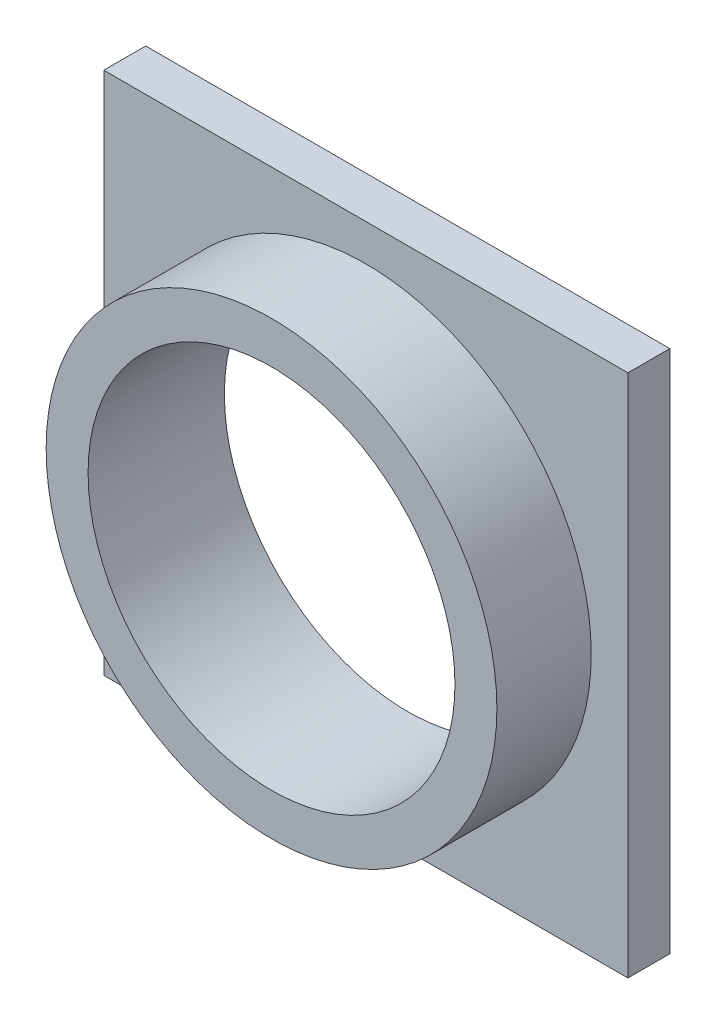
ISO-10303-21;
HEADER;
FILE_DESCRIPTION(('STEP AP214'),'2;1');
FILE_NAME('part.step','',(''),(''),'','','');
FILE_SCHEMA(('AUTOMOTIVE_DESIGN { 1 0 10303 214 1 1 1 1 }'));
ENDSEC;
DATA;
#1=APPLICATION_CONTEXT('core data for automotive mechanical design processes');
#2=APPLICATION_PROTOCOL_DEFINITION('international standard','automotive_design',2000,#1);
#3=PRODUCT_CONTEXT('',#1,'mechanical');
#4=PRODUCT('Part','Part','',(#3));
#5=PRODUCT_RELATED_PRODUCT_CATEGORY('part','',(#4));
#6=PRODUCT_DEFINITION_FORMATION('','',#4);
#7=PRODUCT_DEFINITION_CONTEXT('part definition',#1,'design');
#8=PRODUCT_DEFINITION('design','',#6,#7);
#9=PRODUCT_DEFINITION_SHAPE('','',#8);
#10=(LENGTH_UNIT() NAMED_UNIT(*) SI_UNIT(.MILLI.,.METRE.));
#11=(NAMED_UNIT(*) PLANE_ANGLE_UNIT() SI_UNIT($,.RADIAN.));
#12=(NAMED_UNIT(*) SI_UNIT($,.STERADIAN.) SOLID_ANGLE_UNIT());
#13=UNCERTAINTY_MEASURE_WITH_UNIT(LENGTH_MEASURE(1.E-05),#10,'distance_accuracy_value','');
#14=(GEOMETRIC_REPRESENTATION_CONTEXT(3) GLOBAL_UNCERTAINTY_ASSIGNED_CONTEXT((#13)) GLOBAL_UNIT_ASSIGNED_CONTEXT((#10,
#11,#12)) REPRESENTATION_CONTEXT('',''));
#15=CARTESIAN_POINT('',(0.,0.,0.));
#16=DIRECTION('',(0.,0.,1.));
#17=DIRECTION('',(1.,0.,0.));
#18=AXIS2_PLACEMENT_3D('',#15,#16,#17);
#19=CARTESIAN_POINT('',(-32.25,-32.79,68.5944084089785));
#20=DIRECTION('',(0.,0.,1.));
#21=DIRECTION('',(1.,0.,0.));
#22=AXIS2_PLACEMENT_3D('',#19,#20,#21);
#23=CYLINDRICAL_SURFACE('',#22,10.75);
#24=CARTESIAN_POINT('',(-32.25,-32.79,105.5));
#25=DIRECTION('',(0.,0.,-1.));
#26=DIRECTION('',(-1.,0.,0.));
#27=AXIS2_PLACEMENT_3D('',#24,#25,#26);
#28=CIRCLE('',#27,10.75);
#29=CARTESIAN_POINT('',(-43.,-32.79,105.5));
#30=VERTEX_POINT('',#29);
#31=EDGE_CURVE('E48',#30,#30,#28,.F.);
#32=ORIENTED_EDGE('',*,*,#31,.F.);
#33=EDGE_LOOP('',(#32));
#34=FACE_BOUND('',#33,.T.);
#35=CARTESIAN_POINT('',(-32.25,-32.79,101.));
#36=DIRECTION('',(0.,0.,-1.));
#37=DIRECTION('',(-1.,0.,0.));
#38=AXIS2_PLACEMENT_3D('',#35,#36,#37);
#39=CIRCLE('',#38,10.75);
#40=CARTESIAN_POINT('',(-43.,-32.79,101.));
#41=VERTEX_POINT('',#40);
#42=EDGE_CURVE('E11',#41,#41,#39,.T.);
#43=ORIENTED_EDGE('',*,*,#42,.F.);
#44=EDGE_LOOP('',(#43));
#45=FACE_BOUND('',#44,.T.);
#46=ADVANCED_FACE('F39',(#34,#45),#23,.T.);
#47=CARTESIAN_POINT('',(0.,0.,105.5));
#48=DIRECTION('',(0.,0.,-1.));
#49=DIRECTION('',(-1.,0.,0.));
#50=AXIS2_PLACEMENT_3D('',#47,#48,#49);
#51=PLANE('',#50);
#52=CARTESIAN_POINT('',(-32.25,-32.79,105.5));
#53=DIRECTION('',(0.,0.,-1.));
#54=DIRECTION('',(-1.,0.,0.));
#55=AXIS2_PLACEMENT_3D('',#52,#53,#54);
#56=CIRCLE('',#55,8.75);
#57=CARTESIAN_POINT('',(-41.,-32.79,105.5));
#58=VERTEX_POINT('',#57);
#59=EDGE_CURVE('E121',#58,#58,#56,.F.);
#60=ORIENTED_EDGE('',*,*,#59,.F.);
#61=EDGE_LOOP('',(#60));
#62=FACE_BOUND('',#61,.T.);
#63=ORIENTED_EDGE('',*,*,#31,.T.);
#64=EDGE_LOOP('',(#63));
#65=FACE_BOUND('',#64,.T.);
#66=ADVANCED_FACE('F41',(#62,#65),#51,.F.);
#67=CARTESIAN_POINT('',(32.86,-32.68,99.));
#68=DIRECTION('',(0.,0.,-1.));
#69=DIRECTION('',(-1.,0.,0.));
#70=AXIS2_PLACEMENT_3D('',#67,#68,#69);
#71=PLANE('',#70);
#72=CARTESIAN_POINT('',(-32.25,-32.79,99.));
#73=DIRECTION('',(0.,0.,-1.));
#74=DIRECTION('',(-1.,0.,0.));
#75=AXIS2_PLACEMENT_3D('',#72,#73,#74);
#76=CIRCLE('',#75,8.75);
#77=CARTESIAN_POINT('',(-41.,-32.79,99.));
#78=VERTEX_POINT('',#77);
#79=EDGE_CURVE('E116',#78,#78,#76,.T.);
#80=ORIENTED_EDGE('',*,*,#79,.F.);
#81=EDGE_LOOP('',(#80));
#82=FACE_BOUND('',#81,.T.);
#83=DIRECTION('',(0.,1.,0.));
#84=VECTOR('',#83,1.);
#85=CARTESIAN_POINT('',(-44.75,-20.29,99.));
#86=LINE('',#85,#84);
#87=CARTESIAN_POINT('',(-44.75,-45.29,99.));
#88=VERTEX_POINT('',#87);
#89=CARTESIAN_POINT('',(-44.75,-20.29,99.));
#90=VERTEX_POINT('',#89);
#91=EDGE_CURVE('E107',#88,#90,#86,.T.);
#92=ORIENTED_EDGE('',*,*,#91,.T.);
#93=DIRECTION('',(1.,0.,0.));
#94=VECTOR('',#93,1.);
#95=CARTESIAN_POINT('',(-19.75,-20.29,99.));
#96=LINE('',#95,#94);
#97=CARTESIAN_POINT('',(-19.75,-20.29,99.));
#98=VERTEX_POINT('',#97);
#99=EDGE_CURVE('E110',#90,#98,#96,.T.);
#100=ORIENTED_EDGE('',*,*,#99,.T.);
#101=DIRECTION('',(0.,-1.,0.));
#102=VECTOR('',#101,1.);
#103=CARTESIAN_POINT('',(-19.75,-20.29,99.));
#104=LINE('',#103,#102);
#105=CARTESIAN_POINT('',(-19.75,-45.29,99.));
#106=VERTEX_POINT('',#105);
#107=EDGE_CURVE('E92',#98,#106,#104,.T.);
#108=ORIENTED_EDGE('',*,*,#107,.T.);
#109=DIRECTION('',(-1.,0.,0.));
#110=VECTOR('',#109,1.);
#111=CARTESIAN_POINT('',(-19.75,-45.29,99.));
#112=LINE('',#111,#110);
#113=EDGE_CURVE('E103',#106,#88,#112,.T.);
#114=ORIENTED_EDGE('',*,*,#113,.T.);
#115=EDGE_LOOP('',(#92,#100,#108,#114));
#116=FACE_BOUND('',#115,.T.);
#117=ADVANCED_FACE('F131',(#82,#116),#71,.T.);
#118=CARTESIAN_POINT('',(-32.25,-32.79,137.748737341529));
#119=DIRECTION('',(0.,0.,-1.));
#120=DIRECTION('',(-1.,0.,0.));
#121=AXIS2_PLACEMENT_3D('',#118,#119,#120);
#122=CYLINDRICAL_SURFACE('',#121,8.75);
#123=ORIENTED_EDGE('',*,*,#59,.T.);
#124=EDGE_LOOP('',(#123));
#125=FACE_BOUND('',#124,.T.);
#126=ORIENTED_EDGE('',*,*,#79,.T.);
#127=EDGE_LOOP('',(#126));
#128=FACE_BOUND('',#127,.T.);
#129=ADVANCED_FACE('F126',(#125,#128),#122,.F.);
#130=CARTESIAN_POINT('',(-44.75,-20.29,101.));
#131=DIRECTION('',(-1.,0.,0.));
#132=DIRECTION('',(0.,0.,1.));
#133=AXIS2_PLACEMENT_3D('',#130,#131,#132);
#134=PLANE('',#133);
#135=ORIENTED_EDGE('',*,*,#91,.F.);
#136=DIRECTION('',(0.,0.,-1.));
#137=VECTOR('',#136,1.);
#138=CARTESIAN_POINT('',(-44.75,-45.29,101.));
#139=LINE('',#138,#137);
#140=CARTESIAN_POINT('',(-44.75,-45.29,101.));
#141=VERTEX_POINT('',#140);
#142=EDGE_CURVE('E56',#141,#88,#139,.T.);
#143=ORIENTED_EDGE('',*,*,#142,.F.);
#144=DIRECTION('',(0.,1.,0.));
#145=VECTOR('',#144,1.);
#146=CARTESIAN_POINT('',(-44.75,-20.29,101.));
#147=LINE('',#146,#145);
#148=CARTESIAN_POINT('',(-44.75,-20.29,101.));
#149=VERTEX_POINT('',#148);
#150=EDGE_CURVE('E101',#141,#149,#147,.T.);
#151=ORIENTED_EDGE('',*,*,#150,.T.);
#152=DIRECTION('',(0.,0.,-1.));
#153=VECTOR('',#152,1.);
#154=CARTESIAN_POINT('',(-44.75,-20.29,101.));
#155=LINE('',#154,#153);
#156=EDGE_CURVE('E84',#149,#90,#155,.T.);
#157=ORIENTED_EDGE('',*,*,#156,.T.);
#158=EDGE_LOOP('',(#135,#143,#151,#157));
#159=FACE_BOUND('',#158,.T.);
#160=ADVANCED_FACE('F148',(#159),#134,.T.);
#161=CARTESIAN_POINT('',(-19.75,-45.29,101.));
#162=DIRECTION('',(0.,-1.,0.));
#163=DIRECTION('',(0.,0.,-1.));
#164=AXIS2_PLACEMENT_3D('',#161,#162,#163);
#165=PLANE('',#164);
#166=ORIENTED_EDGE('',*,*,#113,.F.);
#167=DIRECTION('',(0.,0.,-1.));
#168=VECTOR('',#167,1.);
#169=CARTESIAN_POINT('',(-19.75,-45.29,101.));
#170=LINE('',#169,#168);
#171=CARTESIAN_POINT('',(-19.75,-45.29,101.));
#172=VERTEX_POINT('',#171);
#173=EDGE_CURVE('E73',#172,#106,#170,.T.);
#174=ORIENTED_EDGE('',*,*,#173,.F.);
#175=DIRECTION('',(-1.,0.,0.));
#176=VECTOR('',#175,1.);
#177=CARTESIAN_POINT('',(-19.75,-45.29,101.));
#178=LINE('',#177,#176);
#179=EDGE_CURVE('E98',#172,#141,#178,.T.);
#180=ORIENTED_EDGE('',*,*,#179,.T.);
#181=ORIENTED_EDGE('',*,*,#142,.T.);
#182=EDGE_LOOP('',(#166,#174,#180,#181));
#183=FACE_BOUND('',#182,.T.);
#184=ADVANCED_FACE('F145',(#183),#165,.T.);
#185=CARTESIAN_POINT('',(-19.75,-20.29,101.));
#186=DIRECTION('',(1.,0.,0.));
#187=DIRECTION('',(0.,1.,0.));
#188=AXIS2_PLACEMENT_3D('',#185,#186,#187);
#189=PLANE('',#188);
#190=ORIENTED_EDGE('',*,*,#107,.F.);
#191=DIRECTION('',(0.,0.,-1.));
#192=VECTOR('',#191,1.);
#193=CARTESIAN_POINT('',(-19.75,-20.29,101.));
#194=LINE('',#193,#192);
#195=CARTESIAN_POINT('',(-19.75,-20.29,101.));
#196=VERTEX_POINT('',#195);
#197=EDGE_CURVE('E87',#196,#98,#194,.T.);
#198=ORIENTED_EDGE('',*,*,#197,.F.);
#199=DIRECTION('',(0.,-1.,0.));
#200=VECTOR('',#199,1.);
#201=CARTESIAN_POINT('',(-19.75,-20.29,101.));
#202=LINE('',#201,#200);
#203=EDGE_CURVE('E90',#196,#172,#202,.T.);
#204=ORIENTED_EDGE('',*,*,#203,.T.);
#205=ORIENTED_EDGE('',*,*,#173,.T.);
#206=EDGE_LOOP('',(#190,#198,#204,#205));
#207=FACE_BOUND('',#206,.T.);
#208=ADVANCED_FACE('F89',(#207),#189,.T.);
#209=CARTESIAN_POINT('',(-19.75,-20.29,101.));
#210=DIRECTION('',(0.,1.,0.));
#211=DIRECTION('',(0.,0.,1.));
#212=AXIS2_PLACEMENT_3D('',#209,#210,#211);
#213=PLANE('',#212);
#214=ORIENTED_EDGE('',*,*,#99,.F.);
#215=ORIENTED_EDGE('',*,*,#156,.F.);
#216=DIRECTION('',(1.,0.,0.));
#217=VECTOR('',#216,1.);
#218=CARTESIAN_POINT('',(-19.75,-20.29,101.));
#219=LINE('',#218,#217);
#220=EDGE_CURVE('E97',#149,#196,#219,.T.);
#221=ORIENTED_EDGE('',*,*,#220,.T.);
#222=ORIENTED_EDGE('',*,*,#197,.T.);
#223=EDGE_LOOP('',(#214,#215,#221,#222));
#224=FACE_BOUND('',#223,.T.);
#225=ADVANCED_FACE('F100',(#224),#213,.T.);
#226=CARTESIAN_POINT('',(0.,0.,101.));
#227=DIRECTION('',(0.,0.,-1.));
#228=DIRECTION('',(-1.,0.,0.));
#229=AXIS2_PLACEMENT_3D('',#226,#227,#228);
#230=PLANE('',#229);
#231=ORIENTED_EDGE('',*,*,#42,.T.);
#232=EDGE_LOOP('',(#231));
#233=FACE_BOUND('',#232,.T.);
#234=ORIENTED_EDGE('',*,*,#150,.F.);
#235=ORIENTED_EDGE('',*,*,#179,.F.);
#236=ORIENTED_EDGE('',*,*,#203,.F.);
#237=ORIENTED_EDGE('',*,*,#220,.F.);
#238=EDGE_LOOP('',(#234,#235,#236,#237));
#239=FACE_BOUND('',#238,.T.);
#240=ADVANCED_FACE('F96',(#233,#239),#230,.F.);
#241=CLOSED_SHELL('',(#46,#66,#117,#129,#160,#184,#208,#225,#240));
#242=MANIFOLD_SOLID_BREP('B2',#241);
#243=ADVANCED_BREP_SHAPE_REPRESENTATION('',(#18,#242),#14);
#244=SHAPE_DEFINITION_REPRESENTATION(#9,#243);
ENDSEC;
END-ISO-10303-21;
